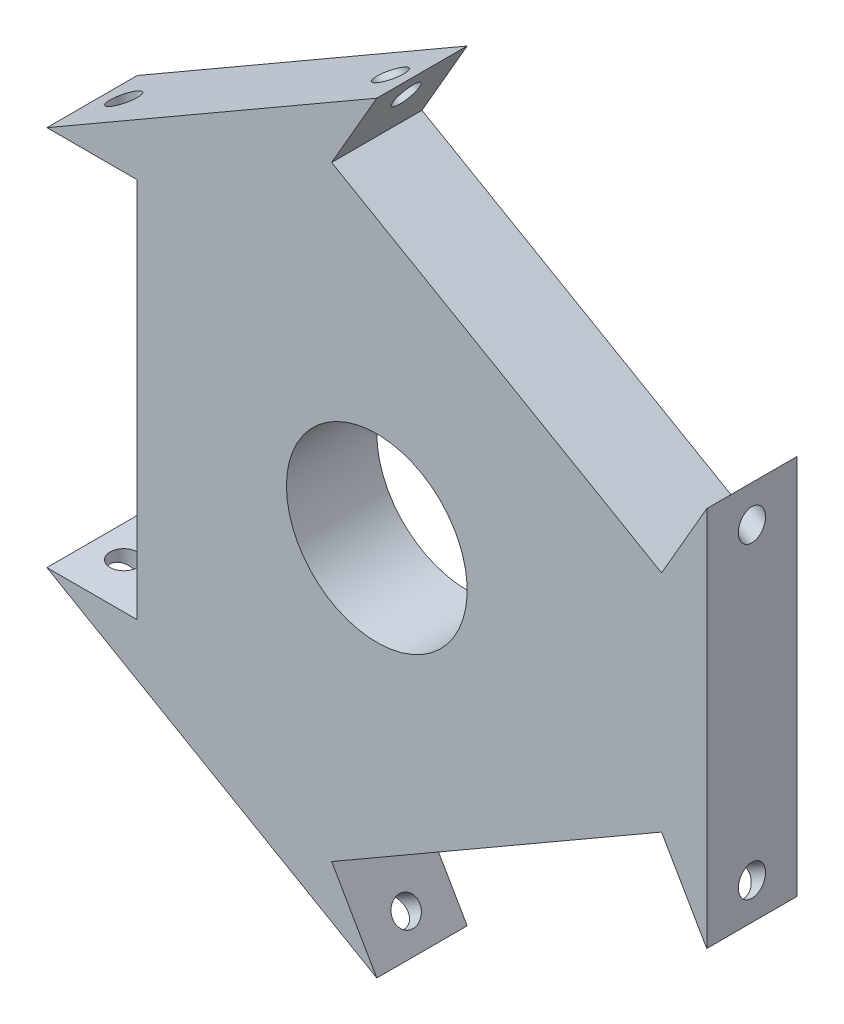
ISO-10303-21;
HEADER;
FILE_DESCRIPTION(('STEP AP214'),'2;1');
FILE_NAME('part.step','',(''),(''),'','','');
FILE_SCHEMA(('AUTOMOTIVE_DESIGN { 1 0 10303 214 1 1 1 1 }'));
ENDSEC;
DATA;
#1=APPLICATION_CONTEXT('core data for automotive mechanical design processes');
#2=APPLICATION_PROTOCOL_DEFINITION('international standard','automotive_design',2000,#1);
#3=PRODUCT_CONTEXT('',#1,'mechanical');
#4=PRODUCT('Part','Part','',(#3));
#5=PRODUCT_RELATED_PRODUCT_CATEGORY('part','',(#4));
#6=PRODUCT_DEFINITION_FORMATION('','',#4);
#7=PRODUCT_DEFINITION_CONTEXT('part definition',#1,'design');
#8=PRODUCT_DEFINITION('design','',#6,#7);
#9=PRODUCT_DEFINITION_SHAPE('','',#8);
#10=(LENGTH_UNIT() NAMED_UNIT(*) SI_UNIT(.MILLI.,.METRE.));
#11=(NAMED_UNIT(*) PLANE_ANGLE_UNIT() SI_UNIT($,.RADIAN.));
#12=(NAMED_UNIT(*) SI_UNIT($,.STERADIAN.) SOLID_ANGLE_UNIT());
#13=UNCERTAINTY_MEASURE_WITH_UNIT(LENGTH_MEASURE(1.E-05),#10,'distance_accuracy_value','');
#14=(GEOMETRIC_REPRESENTATION_CONTEXT(3) GLOBAL_UNCERTAINTY_ASSIGNED_CONTEXT((#13)) GLOBAL_UNIT_ASSIGNED_CONTEXT((#10,
#11,#12)) REPRESENTATION_CONTEXT('',''));
#15=CARTESIAN_POINT('',(0.,0.,0.));
#16=DIRECTION('',(0.,0.,1.));
#17=DIRECTION('',(1.,0.,0.));
#18=AXIS2_PLACEMENT_3D('',#15,#16,#17);
#19=CARTESIAN_POINT('',(36.5109711137769,21.0796190009138,10.));
#20=DIRECTION('',(0.866025403784439,-0.5,0.));
#21=DIRECTION('',(0.5,0.866025403784439,0.));
#22=AXIS2_PLACEMENT_3D('',#19,#20,#21);
#23=PLANE('',#22);
#24=CARTESIAN_POINT('',(34.7609711137767,18.0485300876679,5.));
#25=DIRECTION('',(0.866025403784439,-0.5,0.));
#26=DIRECTION('',(0.5,0.866025403784439,0.));
#27=AXIS2_PLACEMENT_3D('',#24,#25,#26);
#28=CIRCLE('',#27,1.5);
#29=CARTESIAN_POINT('',(35.5109711137767,19.3475681933446,5.));
#30=VERTEX_POINT('',#29);
#31=EDGE_CURVE('E239',#30,#30,#28,.F.);
#32=ORIENTED_EDGE('',*,*,#31,.F.);
#33=EDGE_LOOP('',(#32));
#34=FACE_BOUND('',#33,.T.);
#35=DIRECTION('',(-0.5,-0.866025403784439,0.));
#36=VECTOR('',#35,1.);
#37=CARTESIAN_POINT('',(36.5109711137769,21.0796190009138,0.));
#38=LINE('',#37,#36);
#39=CARTESIAN_POINT('',(36.5109711137769,21.0796190009138,0.));
#40=VERTEX_POINT('',#39);
#41=CARTESIAN_POINT('',(31.5109711137769,12.4193649630694,0.));
#42=VERTEX_POINT('',#41);
#43=EDGE_CURVE('E166',#40,#42,#38,.T.);
#44=ORIENTED_EDGE('',*,*,#43,.T.);
#45=DIRECTION('',(0.,0.,-1.));
#46=VECTOR('',#45,1.);
#47=CARTESIAN_POINT('',(31.5109711137769,12.4193649630694,10.));
#48=LINE('',#47,#46);
#49=CARTESIAN_POINT('',(31.5109711137769,12.4193649630694,10.));
#50=VERTEX_POINT('',#49);
#51=EDGE_CURVE('E13',#50,#42,#48,.T.);
#52=ORIENTED_EDGE('',*,*,#51,.F.);
#53=DIRECTION('',(-0.5,-0.866025403784439,0.));
#54=VECTOR('',#53,1.);
#55=CARTESIAN_POINT('',(36.5109711137769,21.0796190009138,10.));
#56=LINE('',#55,#54);
#57=CARTESIAN_POINT('',(36.5109711137769,21.0796190009138,10.));
#58=VERTEX_POINT('',#57);
#59=EDGE_CURVE('E189',#58,#50,#56,.T.);
#60=ORIENTED_EDGE('',*,*,#59,.F.);
#61=DIRECTION('',(0.,0.,-1.));
#62=VECTOR('',#61,1.);
#63=CARTESIAN_POINT('',(36.5109711137769,21.0796190009138,10.));
#64=LINE('',#63,#62);
#65=EDGE_CURVE('E162',#58,#40,#64,.T.);
#66=ORIENTED_EDGE('',*,*,#65,.T.);
#67=EDGE_LOOP('',(#44,#52,#60,#66));
#68=FACE_BOUND('',#67,.T.);
#69=ADVANCED_FACE('F44',(#34,#68),#23,.F.);
#70=CARTESIAN_POINT('',(31.5109711137769,12.4193649630694,10.));
#71=DIRECTION('',(-0.5,-0.866025403784439,0.));
#72=DIRECTION('',(0.866025403784439,-0.5,0.));
#73=AXIS2_PLACEMENT_3D('',#70,#71,#72);
#74=PLANE('',#73);
#75=DIRECTION('',(-0.866025403784439,0.5,0.));
#76=VECTOR('',#75,1.);
#77=CARTESIAN_POINT('',(31.5109711137769,12.4193649630694,0.));
#78=LINE('',#77,#76);
#79=CARTESIAN_POINT('',(-4.99999999999988,33.4989839639831,0.));
#80=VERTEX_POINT('',#79);
#81=EDGE_CURVE('E169',#42,#80,#78,.T.);
#82=ORIENTED_EDGE('',*,*,#81,.T.);
#83=DIRECTION('',(0.,0.,-1.));
#84=VECTOR('',#83,1.);
#85=CARTESIAN_POINT('',(-4.99999999999988,33.4989839639831,10.));
#86=LINE('',#85,#84);
#87=CARTESIAN_POINT('',(-4.99999999999988,33.4989839639831,10.));
#88=VERTEX_POINT('',#87);
#89=EDGE_CURVE('E53',#88,#80,#86,.T.);
#90=ORIENTED_EDGE('',*,*,#89,.F.);
#91=DIRECTION('',(-0.866025403784439,0.5,0.));
#92=VECTOR('',#91,1.);
#93=CARTESIAN_POINT('',(31.5109711137769,12.4193649630694,10.));
#94=LINE('',#93,#92);
#95=EDGE_CURVE('E117',#50,#88,#94,.T.);
#96=ORIENTED_EDGE('',*,*,#95,.F.);
#97=ORIENTED_EDGE('',*,*,#51,.T.);
#98=EDGE_LOOP('',(#82,#90,#96,#97));
#99=FACE_BOUND('',#98,.T.);
#100=ADVANCED_FACE('F300',(#99),#74,.F.);
#101=CARTESIAN_POINT('',(-4.99999999999988,33.4989839639831,10.));
#102=DIRECTION('',(-0.866025403784441,0.499999999999997,0.));
#103=DIRECTION('',(-0.499999999999997,-0.866025403784441,0.));
#104=AXIS2_PLACEMENT_3D('',#101,#102,#103);
#105=PLANE('',#104);
#106=CARTESIAN_POINT('',(-1.75,39.1281490885818,5.));
#107=DIRECTION('',(-0.866025403784441,0.499999999999997,0.));
#108=DIRECTION('',(-0.499999999999997,-0.866025403784441,0.));
#109=AXIS2_PLACEMENT_3D('',#106,#107,#108);
#110=CIRCLE('',#109,1.5);
#111=CARTESIAN_POINT('',(-2.5,37.8291109829051,5.));
#112=VERTEX_POINT('',#111);
#113=EDGE_CURVE('E236',#112,#112,#110,.F.);
#114=ORIENTED_EDGE('',*,*,#113,.F.);
#115=EDGE_LOOP('',(#114));
#116=FACE_BOUND('',#115,.T.);
#117=DIRECTION('',(0.499999999999997,0.86602540378444,0.));
#118=VECTOR('',#117,1.);
#119=CARTESIAN_POINT('',(-4.99999999999988,33.4989839639831,0.));
#120=LINE('',#119,#118);
#121=CARTESIAN_POINT('',(0.,42.1592380018273,0.));
#122=VERTEX_POINT('',#121);
#123=EDGE_CURVE('E172',#80,#122,#120,.T.);
#124=ORIENTED_EDGE('',*,*,#123,.T.);
#125=DIRECTION('',(0.,0.,-1.));
#126=VECTOR('',#125,1.);
#127=CARTESIAN_POINT('',(0.,42.1592380018273,10.));
#128=LINE('',#127,#126);
#129=CARTESIAN_POINT('',(0.,42.1592380018273,10.));
#130=VERTEX_POINT('',#129);
#131=EDGE_CURVE('E208',#130,#122,#128,.T.);
#132=ORIENTED_EDGE('',*,*,#131,.F.);
#133=DIRECTION('',(0.499999999999997,0.86602540378444,0.));
#134=VECTOR('',#133,1.);
#135=CARTESIAN_POINT('',(-4.99999999999988,33.4989839639831,10.));
#136=LINE('',#135,#134);
#137=EDGE_CURVE('E256',#88,#130,#136,.T.);
#138=ORIENTED_EDGE('',*,*,#137,.F.);
#139=ORIENTED_EDGE('',*,*,#89,.T.);
#140=EDGE_LOOP('',(#124,#132,#138,#139));
#141=FACE_BOUND('',#140,.T.);
#142=ADVANCED_FACE('F305',(#116,#141),#105,.F.);
#143=CARTESIAN_POINT('',(0.,42.1592380018273,10.));
#144=DIRECTION('',(0.500000000000001,-0.866025403784438,0.));
#145=DIRECTION('',(0.866025403784438,0.500000000000001,0.));
#146=AXIS2_PLACEMENT_3D('',#143,#144,#145);
#147=PLANE('',#146);
#148=CARTESIAN_POINT('',(-3.49999999999998,40.1385120596636,5.));
#149=DIRECTION('',(0.500000000000001,-0.866025403784438,0.));
#150=DIRECTION('',(-0.866025403784438,-0.500000000000001,0.));
#151=AXIS2_PLACEMENT_3D('',#148,#149,#150);
#152=ELLIPSE('',#151,1.73205080756888,1.5);
#153=CARTESIAN_POINT('',(-4.99999999999997,39.2724866558792,5.));
#154=VERTEX_POINT('',#153);
#155=EDGE_CURVE('E233',#154,#154,#152,.F.);
#156=ORIENTED_EDGE('',*,*,#155,.F.);
#157=EDGE_LOOP('',(#156));
#158=FACE_BOUND('',#157,.T.);
#159=CARTESIAN_POINT('',(-33.0109711137766,23.1003449430773,5.));
#160=DIRECTION('',(0.500000000000001,-0.866025403784438,0.));
#161=DIRECTION('',(-0.866025403784438,-0.500000000000001,0.));
#162=AXIS2_PLACEMENT_3D('',#159,#160,#161);
#163=ELLIPSE('',#162,1.73205080756888,1.5);
#164=CARTESIAN_POINT('',(-34.5109711137766,22.2343195392929,5.));
#165=VERTEX_POINT('',#164);
#166=EDGE_CURVE('E170',#165,#165,#163,.F.);
#167=ORIENTED_EDGE('',*,*,#166,.F.);
#168=EDGE_LOOP('',(#167));
#169=FACE_BOUND('',#168,.T.);
#170=DIRECTION('',(-0.866025403784438,-0.500000000000001,0.));
#171=VECTOR('',#170,1.);
#172=CARTESIAN_POINT('',(0.,42.1592380018273,0.));
#173=LINE('',#172,#171);
#174=CARTESIAN_POINT('',(-36.5109711137768,21.0796190009136,0.));
#175=VERTEX_POINT('',#174);
#176=EDGE_CURVE('E174',#122,#175,#173,.T.);
#177=ORIENTED_EDGE('',*,*,#176,.T.);
#178=DIRECTION('',(0.,0.,-1.));
#179=VECTOR('',#178,1.);
#180=CARTESIAN_POINT('',(-36.5109711137768,21.0796190009136,10.));
#181=LINE('',#180,#179);
#182=CARTESIAN_POINT('',(-36.5109711137768,21.0796190009136,10.));
#183=VERTEX_POINT('',#182);
#184=EDGE_CURVE('E205',#183,#175,#181,.T.);
#185=ORIENTED_EDGE('',*,*,#184,.F.);
#186=DIRECTION('',(-0.866025403784438,-0.500000000000001,0.));
#187=VECTOR('',#186,1.);
#188=CARTESIAN_POINT('',(0.,42.1592380018273,10.));
#189=LINE('',#188,#187);
#190=EDGE_CURVE('E258',#130,#183,#189,.T.);
#191=ORIENTED_EDGE('',*,*,#190,.F.);
#192=ORIENTED_EDGE('',*,*,#131,.T.);
#193=EDGE_LOOP('',(#177,#185,#191,#192));
#194=FACE_BOUND('',#193,.T.);
#195=ADVANCED_FACE('F333',(#158,#169,#194),#147,.F.);
#196=CARTESIAN_POINT('',(-36.5109711137768,21.0796190009136,10.));
#197=DIRECTION('',(0.,1.,0.));
#198=DIRECTION('',(0.,0.,1.));
#199=AXIS2_PLACEMENT_3D('',#196,#197,#198);
#200=PLANE('',#199);
#201=CARTESIAN_POINT('',(-33.0109711137766,21.0796190009136,5.));
#202=DIRECTION('',(0.,1.,0.));
#203=DIRECTION('',(0.,0.,1.));
#204=AXIS2_PLACEMENT_3D('',#201,#202,#203);
#205=CIRCLE('',#204,1.5);
#206=CARTESIAN_POINT('',(-33.0109711137766,21.0796190009136,6.5));
#207=VERTEX_POINT('',#206);
#208=EDGE_CURVE('E249',#207,#207,#205,.F.);
#209=ORIENTED_EDGE('',*,*,#208,.F.);
#210=EDGE_LOOP('',(#209));
#211=FACE_BOUND('',#210,.T.);
#212=DIRECTION('',(1.,0.,0.));
#213=VECTOR('',#212,1.);
#214=CARTESIAN_POINT('',(-36.5109711137768,21.0796190009136,0.));
#215=LINE('',#214,#213);
#216=CARTESIAN_POINT('',(-26.5109711137768,21.0796190009136,0.));
#217=VERTEX_POINT('',#216);
#218=EDGE_CURVE('E176',#175,#217,#215,.T.);
#219=ORIENTED_EDGE('',*,*,#218,.T.);
#220=DIRECTION('',(0.,0.,-1.));
#221=VECTOR('',#220,1.);
#222=CARTESIAN_POINT('',(-26.5109711137768,21.0796190009136,10.));
#223=LINE('',#222,#221);
#224=CARTESIAN_POINT('',(-26.5109711137768,21.0796190009136,10.));
#225=VERTEX_POINT('',#224);
#226=EDGE_CURVE('E202',#225,#217,#223,.T.);
#227=ORIENTED_EDGE('',*,*,#226,.F.);
#228=DIRECTION('',(1.,0.,0.));
#229=VECTOR('',#228,1.);
#230=CARTESIAN_POINT('',(-36.5109711137768,21.0796190009136,10.));
#231=LINE('',#230,#229);
#232=EDGE_CURVE('E260',#183,#225,#231,.T.);
#233=ORIENTED_EDGE('',*,*,#232,.F.);
#234=ORIENTED_EDGE('',*,*,#184,.T.);
#235=EDGE_LOOP('',(#219,#227,#233,#234));
#236=FACE_BOUND('',#235,.T.);
#237=ADVANCED_FACE('F346',(#211,#236),#200,.F.);
#238=CARTESIAN_POINT('',(-26.5109711137768,21.0796190009136,10.));
#239=DIRECTION('',(1.,0.,0.));
#240=DIRECTION('',(0.,0.,-1.));
#241=AXIS2_PLACEMENT_3D('',#238,#239,#240);
#242=PLANE('',#241);
#243=DIRECTION('',(0.,-1.,0.));
#244=VECTOR('',#243,1.);
#245=CARTESIAN_POINT('',(-26.5109711137768,21.0796190009136,0.));
#246=LINE('',#245,#244);
#247=CARTESIAN_POINT('',(-26.5109711137768,-21.0796190009138,0.));
#248=VERTEX_POINT('',#247);
#249=EDGE_CURVE('E178',#217,#248,#246,.T.);
#250=ORIENTED_EDGE('',*,*,#249,.T.);
#251=DIRECTION('',(0.,0.,-1.));
#252=VECTOR('',#251,1.);
#253=CARTESIAN_POINT('',(-26.5109711137768,-21.0796190009138,10.));
#254=LINE('',#253,#252);
#255=CARTESIAN_POINT('',(-26.5109711137768,-21.0796190009138,10.));
#256=VERTEX_POINT('',#255);
#257=EDGE_CURVE('E199',#256,#248,#254,.T.);
#258=ORIENTED_EDGE('',*,*,#257,.F.);
#259=DIRECTION('',(0.,-1.,0.));
#260=VECTOR('',#259,1.);
#261=CARTESIAN_POINT('',(-26.5109711137768,21.0796190009136,10.));
#262=LINE('',#261,#260);
#263=EDGE_CURVE('E262',#225,#256,#262,.T.);
#264=ORIENTED_EDGE('',*,*,#263,.F.);
#265=ORIENTED_EDGE('',*,*,#226,.T.);
#266=EDGE_LOOP('',(#250,#258,#264,#265));
#267=FACE_BOUND('',#266,.T.);
#268=ADVANCED_FACE('F350',(#267),#242,.F.);
#269=CARTESIAN_POINT('',(-26.5109711137768,-21.0796190009138,10.));
#270=DIRECTION('',(0.,-1.,0.));
#271=DIRECTION('',(0.,0.,-1.));
#272=AXIS2_PLACEMENT_3D('',#269,#270,#271);
#273=PLANE('',#272);
#274=CARTESIAN_POINT('',(-33.0109711137766,-21.0796190009138,5.));
#275=DIRECTION('',(0.,-1.,0.));
#276=DIRECTION('',(0.,0.,-1.));
#277=AXIS2_PLACEMENT_3D('',#274,#275,#276);
#278=CIRCLE('',#277,1.5);
#279=CARTESIAN_POINT('',(-33.0109711137766,-21.0796190009138,3.5));
#280=VERTEX_POINT('',#279);
#281=EDGE_CURVE('E215',#280,#280,#278,.F.);
#282=ORIENTED_EDGE('',*,*,#281,.F.);
#283=EDGE_LOOP('',(#282));
#284=FACE_BOUND('',#283,.T.);
#285=DIRECTION('',(-1.,0.,0.));
#286=VECTOR('',#285,1.);
#287=CARTESIAN_POINT('',(-26.5109711137768,-21.0796190009138,0.));
#288=LINE('',#287,#286);
#289=CARTESIAN_POINT('',(-36.5109711137766,-21.0796190009138,0.));
#290=VERTEX_POINT('',#289);
#291=EDGE_CURVE('E180',#248,#290,#288,.T.);
#292=ORIENTED_EDGE('',*,*,#291,.T.);
#293=DIRECTION('',(0.,0.,-1.));
#294=VECTOR('',#293,1.);
#295=CARTESIAN_POINT('',(-36.5109711137766,-21.0796190009138,10.));
#296=LINE('',#295,#294);
#297=CARTESIAN_POINT('',(-36.5109711137766,-21.0796190009138,10.));
#298=VERTEX_POINT('',#297);
#299=EDGE_CURVE('E196',#298,#290,#296,.T.);
#300=ORIENTED_EDGE('',*,*,#299,.F.);
#301=DIRECTION('',(-1.,0.,0.));
#302=VECTOR('',#301,1.);
#303=CARTESIAN_POINT('',(-26.5109711137768,-21.0796190009138,10.));
#304=LINE('',#303,#302);
#305=EDGE_CURVE('E264',#256,#298,#304,.T.);
#306=ORIENTED_EDGE('',*,*,#305,.F.);
#307=ORIENTED_EDGE('',*,*,#257,.T.);
#308=EDGE_LOOP('',(#292,#300,#306,#307));
#309=FACE_BOUND('',#308,.T.);
#310=ADVANCED_FACE('F353',(#284,#309),#273,.F.);
#311=CARTESIAN_POINT('',(-36.5109711137766,-21.0796190009138,10.));
#312=DIRECTION('',(0.499999999999995,0.866025403784442,0.));
#313=DIRECTION('',(-0.866025403784442,0.499999999999995,0.));
#314=AXIS2_PLACEMENT_3D('',#311,#312,#313);
#315=PLANE('',#314);
#316=CARTESIAN_POINT('',(-3.50000000000018,-40.1385120596633,5.));
#317=DIRECTION('',(0.499999999999995,0.866025403784442,0.));
#318=DIRECTION('',(0.866025403784442,-0.499999999999995,0.));
#319=AXIS2_PLACEMENT_3D('',#316,#317,#318);
#320=ELLIPSE('',#319,1.7320508075689,1.5);
#321=CARTESIAN_POINT('',(-2.00000000000016,-41.0045374634478,5.));
#322=VERTEX_POINT('',#321);
#323=EDGE_CURVE('E228',#322,#322,#320,.F.);
#324=ORIENTED_EDGE('',*,*,#323,.F.);
#325=EDGE_LOOP('',(#324));
#326=FACE_BOUND('',#325,.T.);
#327=CARTESIAN_POINT('',(-33.0109711137766,-23.1003449430775,5.));
#328=DIRECTION('',(0.499999999999995,0.866025403784442,0.));
#329=DIRECTION('',(0.866025403784442,-0.499999999999995,0.));
#330=AXIS2_PLACEMENT_3D('',#327,#328,#329);
#331=ELLIPSE('',#330,1.73205080756888,1.5);
#332=CARTESIAN_POINT('',(-31.5109711137766,-23.9663703468619,5.));
#333=VERTEX_POINT('',#332);
#334=EDGE_CURVE('E213',#333,#333,#331,.F.);
#335=ORIENTED_EDGE('',*,*,#334,.F.);
#336=EDGE_LOOP('',(#335));
#337=FACE_BOUND('',#336,.T.);
#338=DIRECTION('',(0.866025403784442,-0.499999999999995,0.));
#339=VECTOR('',#338,1.);
#340=CARTESIAN_POINT('',(-36.5109711137766,-21.0796190009138,0.));
#341=LINE('',#340,#339);
#342=CARTESIAN_POINT('',(2.94396385486453E-13,-42.1592380018273,0.));
#343=VERTEX_POINT('',#342);
#344=EDGE_CURVE('E182',#290,#343,#341,.T.);
#345=ORIENTED_EDGE('',*,*,#344,.T.);
#346=DIRECTION('',(0.,0.,-1.));
#347=VECTOR('',#346,1.);
#348=CARTESIAN_POINT('',(2.94396385486453E-13,-42.1592380018273,10.));
#349=LINE('',#348,#347);
#350=CARTESIAN_POINT('',(2.94396385486453E-13,-42.1592380018273,10.));
#351=VERTEX_POINT('',#350);
#352=EDGE_CURVE('E193',#351,#343,#349,.T.);
#353=ORIENTED_EDGE('',*,*,#352,.F.);
#354=DIRECTION('',(0.866025403784442,-0.499999999999995,0.));
#355=VECTOR('',#354,1.);
#356=CARTESIAN_POINT('',(-36.5109711137766,-21.0796190009138,10.));
#357=LINE('',#356,#355);
#358=EDGE_CURVE('E266',#298,#351,#357,.T.);
#359=ORIENTED_EDGE('',*,*,#358,.F.);
#360=ORIENTED_EDGE('',*,*,#299,.T.);
#361=EDGE_LOOP('',(#345,#353,#359,#360));
#362=FACE_BOUND('',#361,.T.);
#363=ADVANCED_FACE('F272',(#326,#337,#362),#315,.F.);
#364=CARTESIAN_POINT('',(2.94396385486453E-13,-42.1592380018273,10.));
#365=DIRECTION('',(-0.866025403784432,-0.500000000000011,0.));
#366=DIRECTION('',(0.500000000000011,-0.866025403784432,0.));
#367=AXIS2_PLACEMENT_3D('',#364,#365,#366);
#368=PLANE('',#367);
#369=CARTESIAN_POINT('',(-1.74999999999996,-39.1281490885814,5.));
#370=DIRECTION('',(-0.866025403784432,-0.500000000000011,0.));
#371=DIRECTION('',(0.500000000000011,-0.866025403784432,0.));
#372=AXIS2_PLACEMENT_3D('',#369,#370,#371);
#373=CIRCLE('',#372,1.5);
#374=CARTESIAN_POINT('',(-0.999999999999945,-40.4271871942581,5.));
#375=VERTEX_POINT('',#374);
#376=EDGE_CURVE('E223',#375,#375,#373,.F.);
#377=ORIENTED_EDGE('',*,*,#376,.F.);
#378=EDGE_LOOP('',(#377));
#379=FACE_BOUND('',#378,.T.);
#380=DIRECTION('',(-0.500000000000011,0.866025403784432,0.));
#381=VECTOR('',#380,1.);
#382=CARTESIAN_POINT('',(2.94396385486453E-13,-42.1592380018273,0.));
#383=LINE('',#382,#381);
#384=CARTESIAN_POINT('',(-4.99999999999977,-33.4989839639831,0.));
#385=VERTEX_POINT('',#384);
#386=EDGE_CURVE('E184',#343,#385,#383,.T.);
#387=ORIENTED_EDGE('',*,*,#386,.T.);
#388=DIRECTION('',(0.,0.,-1.));
#389=VECTOR('',#388,1.);
#390=CARTESIAN_POINT('',(-4.99999999999977,-33.4989839639831,10.));
#391=LINE('',#390,#389);
#392=CARTESIAN_POINT('',(-4.99999999999977,-33.4989839639831,10.));
#393=VERTEX_POINT('',#392);
#394=EDGE_CURVE('E157',#393,#385,#391,.T.);
#395=ORIENTED_EDGE('',*,*,#394,.F.);
#396=DIRECTION('',(-0.500000000000011,0.866025403784432,0.));
#397=VECTOR('',#396,1.);
#398=CARTESIAN_POINT('',(2.94396385486453E-13,-42.1592380018273,10.));
#399=LINE('',#398,#397);
#400=EDGE_CURVE('E148',#351,#393,#399,.T.);
#401=ORIENTED_EDGE('',*,*,#400,.F.);
#402=ORIENTED_EDGE('',*,*,#352,.T.);
#403=EDGE_LOOP('',(#387,#395,#401,#402));
#404=FACE_BOUND('',#403,.T.);
#405=ADVANCED_FACE('F276',(#379,#404),#368,.F.);
#406=CARTESIAN_POINT('',(-4.99999999999977,-33.4989839639831,10.));
#407=DIRECTION('',(-0.500000000000001,0.866025403784438,0.));
#408=DIRECTION('',(-0.866025403784438,-0.500000000000001,0.));
#409=AXIS2_PLACEMENT_3D('',#406,#407,#408);
#410=PLANE('',#409);
#411=DIRECTION('',(0.866025403784438,0.500000000000001,0.));
#412=VECTOR('',#411,1.);
#413=CARTESIAN_POINT('',(-4.99999999999977,-33.4989839639831,0.));
#414=LINE('',#413,#412);
#415=CARTESIAN_POINT('',(31.510971113777,-12.4193649630694,0.));
#416=VERTEX_POINT('',#415);
#417=EDGE_CURVE('E156',#385,#416,#414,.T.);
#418=ORIENTED_EDGE('',*,*,#417,.T.);
#419=DIRECTION('',(0.,0.,-1.));
#420=VECTOR('',#419,1.);
#421=CARTESIAN_POINT('',(31.510971113777,-12.4193649630694,10.));
#422=LINE('',#421,#420);
#423=CARTESIAN_POINT('',(31.510971113777,-12.4193649630694,10.));
#424=VERTEX_POINT('',#423);
#425=EDGE_CURVE('E153',#424,#416,#422,.T.);
#426=ORIENTED_EDGE('',*,*,#425,.F.);
#427=DIRECTION('',(0.866025403784438,0.500000000000001,0.));
#428=VECTOR('',#427,1.);
#429=CARTESIAN_POINT('',(-4.99999999999977,-33.4989839639831,10.));
#430=LINE('',#429,#428);
#431=EDGE_CURVE('E142',#393,#424,#430,.T.);
#432=ORIENTED_EDGE('',*,*,#431,.F.);
#433=ORIENTED_EDGE('',*,*,#394,.T.);
#434=EDGE_LOOP('',(#418,#426,#432,#433));
#435=FACE_BOUND('',#434,.T.);
#436=ADVANCED_FACE('F154',(#435),#410,.F.);
#437=CARTESIAN_POINT('',(31.510971113777,-12.4193649630694,10.));
#438=DIRECTION('',(0.866025403784429,0.500000000000017,0.));
#439=DIRECTION('',(-0.500000000000017,0.866025403784429,0.));
#440=AXIS2_PLACEMENT_3D('',#437,#438,#439);
#441=PLANE('',#440);
#442=CARTESIAN_POINT('',(34.760971113777,-18.0485300876681,5.));
#443=DIRECTION('',(0.866025403784429,0.500000000000017,0.));
#444=DIRECTION('',(-0.500000000000017,0.866025403784429,0.));
#445=AXIS2_PLACEMENT_3D('',#442,#443,#444);
#446=CIRCLE('',#445,1.5);
#447=CARTESIAN_POINT('',(34.010971113777,-16.7494919819914,5.));
#448=VERTEX_POINT('',#447);
#449=EDGE_CURVE('E219',#448,#448,#446,.F.);
#450=ORIENTED_EDGE('',*,*,#449,.F.);
#451=EDGE_LOOP('',(#450));
#452=FACE_BOUND('',#451,.T.);
#453=DIRECTION('',(0.500000000000017,-0.866025403784429,0.));
#454=VECTOR('',#453,1.);
#455=CARTESIAN_POINT('',(31.510971113777,-12.4193649630694,0.));
#456=LINE('',#455,#454);
#457=CARTESIAN_POINT('',(36.5109711137769,-21.0796190009133,0.));
#458=VERTEX_POINT('',#457);
#459=EDGE_CURVE('E103',#416,#458,#456,.T.);
#460=ORIENTED_EDGE('',*,*,#459,.T.);
#461=DIRECTION('',(0.,0.,-1.));
#462=VECTOR('',#461,1.);
#463=CARTESIAN_POINT('',(36.5109711137769,-21.0796190009133,10.));
#464=LINE('',#463,#462);
#465=CARTESIAN_POINT('',(36.5109711137769,-21.0796190009133,10.));
#466=VERTEX_POINT('',#465);
#467=EDGE_CURVE('E158',#466,#458,#464,.T.);
#468=ORIENTED_EDGE('',*,*,#467,.F.);
#469=DIRECTION('',(0.500000000000017,-0.866025403784429,0.));
#470=VECTOR('',#469,1.);
#471=CARTESIAN_POINT('',(31.510971113777,-12.4193649630694,10.));
#472=LINE('',#471,#470);
#473=EDGE_CURVE('E146',#424,#466,#472,.T.);
#474=ORIENTED_EDGE('',*,*,#473,.F.);
#475=ORIENTED_EDGE('',*,*,#425,.T.);
#476=EDGE_LOOP('',(#460,#468,#474,#475));
#477=FACE_BOUND('',#476,.T.);
#478=ADVANCED_FACE('F160',(#452,#477),#441,.F.);
#479=CARTESIAN_POINT('',(36.5109711137769,-21.0796190009133,10.));
#480=DIRECTION('',(-1.,0.,0.));
#481=DIRECTION('',(0.,-1.,0.));
#482=AXIS2_PLACEMENT_3D('',#479,#480,#481);
#483=PLANE('',#482);
#484=CARTESIAN_POINT('',(36.5109711137769,17.038167116586,5.));
#485=DIRECTION('',(-1.,0.,0.));
#486=DIRECTION('',(0.,1.,0.));
#487=AXIS2_PLACEMENT_3D('',#484,#485,#486);
#488=ELLIPSE('',#487,1.73205080756889,1.5);
#489=CARTESIAN_POINT('',(36.5109711137769,18.7702179241548,5.));
#490=VERTEX_POINT('',#489);
#491=EDGE_CURVE('E47',#490,#490,#488,.F.);
#492=ORIENTED_EDGE('',*,*,#491,.F.);
#493=EDGE_LOOP('',(#492));
#494=FACE_BOUND('',#493,.T.);
#495=CARTESIAN_POINT('',(36.5109711137769,-17.0381671165863,5.));
#496=DIRECTION('',(-1.,0.,0.));
#497=DIRECTION('',(0.,1.,0.));
#498=AXIS2_PLACEMENT_3D('',#495,#496,#497);
#499=ELLIPSE('',#498,1.73205080756887,1.5);
#500=CARTESIAN_POINT('',(36.5109711137769,-15.3061163090174,5.));
#501=VERTEX_POINT('',#500);
#502=EDGE_CURVE('E217',#501,#501,#499,.F.);
#503=ORIENTED_EDGE('',*,*,#502,.F.);
#504=EDGE_LOOP('',(#503));
#505=FACE_BOUND('',#504,.T.);
#506=DIRECTION('',(0.,1.,0.));
#507=VECTOR('',#506,1.);
#508=CARTESIAN_POINT('',(36.5109711137769,-21.0796190009133,0.));
#509=LINE('',#508,#507);
#510=EDGE_CURVE('E109',#458,#40,#509,.T.);
#511=ORIENTED_EDGE('',*,*,#510,.T.);
#512=ORIENTED_EDGE('',*,*,#65,.F.);
#513=DIRECTION('',(0.,1.,0.));
#514=VECTOR('',#513,1.);
#515=CARTESIAN_POINT('',(36.5109711137769,-21.0796190009133,10.));
#516=LINE('',#515,#514);
#517=EDGE_CURVE('E62',#466,#58,#516,.T.);
#518=ORIENTED_EDGE('',*,*,#517,.F.);
#519=ORIENTED_EDGE('',*,*,#467,.T.);
#520=EDGE_LOOP('',(#511,#512,#518,#519));
#521=FACE_BOUND('',#520,.T.);
#522=ADVANCED_FACE('F284',(#494,#505,#521),#483,.F.);
#523=CARTESIAN_POINT('',(0.,0.,10.));
#524=DIRECTION('',(0.,0.,-1.));
#525=DIRECTION('',(-1.,0.,0.));
#526=AXIS2_PLACEMENT_3D('',#523,#524,#525);
#527=PLANE('',#526);
#528=CARTESIAN_POINT('',(0.,0.,10.));
#529=DIRECTION('',(0.,0.,-1.));
#530=DIRECTION('',(-1.,0.,0.));
#531=AXIS2_PLACEMENT_3D('',#528,#529,#530);
#532=CIRCLE('',#531,10.);
#533=CARTESIAN_POINT('',(-10.,0.,10.));
#534=VERTEX_POINT('',#533);
#535=EDGE_CURVE('E216',#534,#534,#532,.T.);
#536=ORIENTED_EDGE('',*,*,#535,.T.);
#537=EDGE_LOOP('',(#536));
#538=FACE_BOUND('',#537,.T.);
#539=ORIENTED_EDGE('',*,*,#59,.T.);
#540=ORIENTED_EDGE('',*,*,#95,.T.);
#541=ORIENTED_EDGE('',*,*,#137,.T.);
#542=ORIENTED_EDGE('',*,*,#190,.T.);
#543=ORIENTED_EDGE('',*,*,#232,.T.);
#544=ORIENTED_EDGE('',*,*,#263,.T.);
#545=ORIENTED_EDGE('',*,*,#305,.T.);
#546=ORIENTED_EDGE('',*,*,#358,.T.);
#547=ORIENTED_EDGE('',*,*,#400,.T.);
#548=ORIENTED_EDGE('',*,*,#431,.T.);
#549=ORIENTED_EDGE('',*,*,#473,.T.);
#550=ORIENTED_EDGE('',*,*,#517,.T.);
#551=EDGE_LOOP('',(#539,#540,#541,#542,#543,#544,#545,#546,#547,#548,#549,#550));
#552=FACE_BOUND('',#551,.T.);
#553=ADVANCED_FACE('F144',(#538,#552),#527,.F.);
#554=CARTESIAN_POINT('',(0.,0.,0.));
#555=DIRECTION('',(0.,0.,-1.));
#556=DIRECTION('',(-1.,0.,0.));
#557=AXIS2_PLACEMENT_3D('',#554,#555,#556);
#558=PLANE('',#557);
#559=CARTESIAN_POINT('',(0.,0.,0.));
#560=DIRECTION('',(0.,0.,-1.));
#561=DIRECTION('',(-1.,0.,0.));
#562=AXIS2_PLACEMENT_3D('',#559,#560,#561);
#563=CIRCLE('',#562,10.);
#564=CARTESIAN_POINT('',(-10.,0.,0.));
#565=VERTEX_POINT('',#564);
#566=EDGE_CURVE('E242',#565,#565,#563,.T.);
#567=ORIENTED_EDGE('',*,*,#566,.F.);
#568=EDGE_LOOP('',(#567));
#569=FACE_BOUND('',#568,.T.);
#570=ORIENTED_EDGE('',*,*,#43,.F.);
#571=ORIENTED_EDGE('',*,*,#510,.F.);
#572=ORIENTED_EDGE('',*,*,#459,.F.);
#573=ORIENTED_EDGE('',*,*,#417,.F.);
#574=ORIENTED_EDGE('',*,*,#386,.F.);
#575=ORIENTED_EDGE('',*,*,#344,.F.);
#576=ORIENTED_EDGE('',*,*,#291,.F.);
#577=ORIENTED_EDGE('',*,*,#249,.F.);
#578=ORIENTED_EDGE('',*,*,#218,.F.);
#579=ORIENTED_EDGE('',*,*,#176,.F.);
#580=ORIENTED_EDGE('',*,*,#123,.F.);
#581=ORIENTED_EDGE('',*,*,#81,.F.);
#582=EDGE_LOOP('',(#570,#571,#572,#573,#574,#575,#576,#577,#578,#579,#580,#581));
#583=FACE_BOUND('',#582,.T.);
#584=ADVANCED_FACE('F279',(#569,#583),#558,.T.);
#585=CARTESIAN_POINT('',(-33.0109711137766,42.1592380018273,5.));
#586=DIRECTION('',(0.,-1.,0.));
#587=DIRECTION('',(0.,0.,-1.));
#588=AXIS2_PLACEMENT_3D('',#585,#586,#587);
#589=CYLINDRICAL_SURFACE('',#588,1.5);
#590=ORIENTED_EDGE('',*,*,#334,.T.);
#591=EDGE_LOOP('',(#590));
#592=FACE_BOUND('',#591,.T.);
#593=ORIENTED_EDGE('',*,*,#281,.T.);
#594=EDGE_LOOP('',(#593));
#595=FACE_BOUND('',#594,.T.);
#596=ADVANCED_FACE('F379',(#592,#595),#589,.F.);
#597=ORIENTED_EDGE('',*,*,#208,.T.);
#598=EDGE_LOOP('',(#597));
#599=FACE_BOUND('',#598,.T.);
#600=ORIENTED_EDGE('',*,*,#166,.T.);
#601=EDGE_LOOP('',(#600));
#602=FACE_BOUND('',#601,.T.);
#603=ADVANCED_FACE('F377',(#599,#602),#589,.F.);
#604=CARTESIAN_POINT('',(0.,0.,10.));
#605=DIRECTION('',(0.,0.,-1.));
#606=DIRECTION('',(-1.,0.,0.));
#607=AXIS2_PLACEMENT_3D('',#604,#605,#606);
#608=CYLINDRICAL_SURFACE('',#607,10.);
#609=ORIENTED_EDGE('',*,*,#535,.F.);
#610=EDGE_LOOP('',(#609));
#611=FACE_BOUND('',#610,.T.);
#612=ORIENTED_EDGE('',*,*,#566,.T.);
#613=EDGE_LOOP('',(#612));
#614=FACE_BOUND('',#613,.T.);
#615=ADVANCED_FACE('F321',(#611,#614),#608,.F.);
#616=CARTESIAN_POINT('',(-29.133228335333,-54.9378633392666,5.));
#617=DIRECTION('',(0.866025403784443,0.499999999999992,0.));
#618=DIRECTION('',(-0.499999999999992,0.866025403784443,0.));
#619=AXIS2_PLACEMENT_3D('',#616,#617,#618);
#620=CYLINDRICAL_SURFACE('',#619,1.5);
#621=ORIENTED_EDGE('',*,*,#502,.T.);
#622=EDGE_LOOP('',(#621));
#623=FACE_BOUND('',#622,.T.);
#624=ORIENTED_EDGE('',*,*,#449,.T.);
#625=EDGE_LOOP('',(#624));
#626=FACE_BOUND('',#625,.T.);
#627=ADVANCED_FACE('F311',(#623,#626),#620,.F.);
#628=CARTESIAN_POINT('',(62.1441994491095,2.23881583698238,5.));
#629=DIRECTION('',(-0.866025403784436,0.500000000000004,0.));
#630=DIRECTION('',(-0.500000000000004,-0.866025403784436,0.));
#631=AXIS2_PLACEMENT_3D('',#628,#629,#630);
#632=CYLINDRICAL_SURFACE('',#631,1.5);
#633=ORIENTED_EDGE('',*,*,#491,.T.);
#634=EDGE_LOOP('',(#633));
#635=FACE_BOUND('',#634,.T.);
#636=ORIENTED_EDGE('',*,*,#31,.T.);
#637=EDGE_LOOP('',(#636));
#638=FACE_BOUND('',#637,.T.);
#639=ADVANCED_FACE('F308',(#635,#638),#632,.F.);
#640=ORIENTED_EDGE('',*,*,#376,.T.);
#641=EDGE_LOOP('',(#640));
#642=FACE_BOUND('',#641,.T.);
#643=ORIENTED_EDGE('',*,*,#323,.T.);
#644=EDGE_LOOP('',(#643));
#645=FACE_BOUND('',#644,.T.);
#646=ADVANCED_FACE('F310',(#642,#645),#620,.F.);
#647=ORIENTED_EDGE('',*,*,#155,.T.);
#648=EDGE_LOOP('',(#647));
#649=FACE_BOUND('',#648,.T.);
#650=ORIENTED_EDGE('',*,*,#113,.T.);
#651=EDGE_LOOP('',(#650));
#652=FACE_BOUND('',#651,.T.);
#653=ADVANCED_FACE('F314',(#649,#652),#632,.F.);
#654=CLOSED_SHELL('',(#69,#100,#142,#195,#237,#268,#310,#363,#405,#436,#478,#522,#553,#584,#596,
#603,#615,#627,#639,#646,#653));
#655=MANIFOLD_SOLID_BREP('B2',#654);
#656=ADVANCED_BREP_SHAPE_REPRESENTATION('',(#18,#655),#14);
#657=SHAPE_DEFINITION_REPRESENTATION(#9,#656);
ENDSEC;
END-ISO-10303-21;
